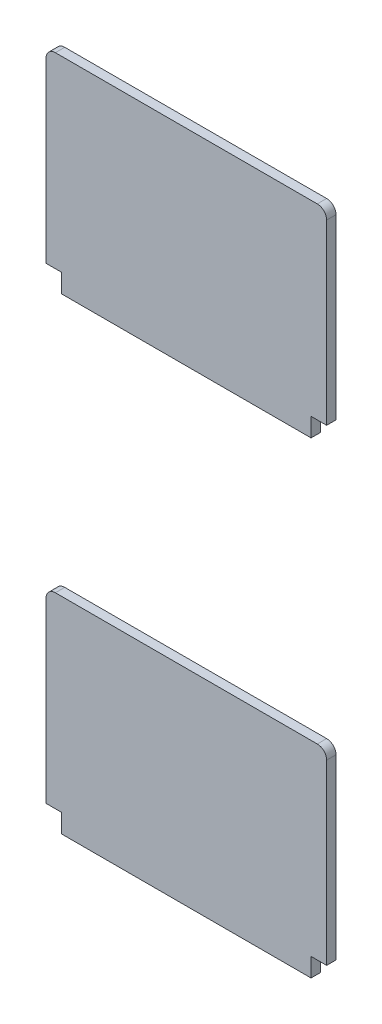
ISO-10303-21;
HEADER;
FILE_DESCRIPTION(('STEP AP214'),'2;1');
FILE_NAME('part.step','',(''),(''),'','','');
FILE_SCHEMA(('AUTOMOTIVE_DESIGN { 1 0 10303 214 1 1 1 1 }'));
ENDSEC;
DATA;
#1=APPLICATION_CONTEXT('core data for automotive mechanical design processes');
#2=APPLICATION_PROTOCOL_DEFINITION('international standard','automotive_design',2000,#1);
#3=PRODUCT_CONTEXT('',#1,'mechanical');
#4=PRODUCT('Part','Part','',(#3));
#5=PRODUCT_RELATED_PRODUCT_CATEGORY('part','',(#4));
#6=PRODUCT_DEFINITION_FORMATION('','',#4);
#7=PRODUCT_DEFINITION_CONTEXT('part definition',#1,'design');
#8=PRODUCT_DEFINITION('design','',#6,#7);
#9=PRODUCT_DEFINITION_SHAPE('','',#8);
#10=(LENGTH_UNIT() NAMED_UNIT(*) SI_UNIT(.MILLI.,.METRE.));
#11=(NAMED_UNIT(*) PLANE_ANGLE_UNIT() SI_UNIT($,.RADIAN.));
#12=(NAMED_UNIT(*) SI_UNIT($,.STERADIAN.) SOLID_ANGLE_UNIT());
#13=UNCERTAINTY_MEASURE_WITH_UNIT(LENGTH_MEASURE(1.E-05),#10,'distance_accuracy_value','');
#14=(GEOMETRIC_REPRESENTATION_CONTEXT(3) GLOBAL_UNCERTAINTY_ASSIGNED_CONTEXT((#13)) GLOBAL_UNIT_ASSIGNED_CONTEXT((#10,
#11,#12)) REPRESENTATION_CONTEXT('',''));
#15=CARTESIAN_POINT('',(0.,0.,0.));
#16=DIRECTION('',(0.,0.,1.));
#17=DIRECTION('',(1.,0.,0.));
#18=AXIS2_PLACEMENT_3D('',#15,#16,#17);
#19=CARTESIAN_POINT('',(-1.99999999999998,207.,3.));
#20=DIRECTION('',(0.,0.,-1.));
#21=DIRECTION('',(-1.,0.,0.));
#22=AXIS2_PLACEMENT_3D('',#19,#20,#21);
#23=CYLINDRICAL_SURFACE('',#22,3.00000000000001);
#24=CARTESIAN_POINT('',(-1.99999999999998,207.,0.));
#25=DIRECTION('',(0.,0.,-1.));
#26=DIRECTION('',(-1.,0.,0.));
#27=AXIS2_PLACEMENT_3D('',#24,#25,#26);
#28=CIRCLE('',#27,3.00000000000001);
#29=CARTESIAN_POINT('',(-4.99999999999999,207.,0.));
#30=VERTEX_POINT('',#29);
#31=CARTESIAN_POINT('',(-1.99999999999998,210.,0.));
#32=VERTEX_POINT('',#31);
#33=EDGE_CURVE('E162',#30,#32,#28,.T.);
#34=ORIENTED_EDGE('',*,*,#33,.F.);
#35=DIRECTION('',(0.,0.,-1.));
#36=VECTOR('',#35,1.);
#37=CARTESIAN_POINT('',(-4.99999999999999,207.,3.));
#38=LINE('',#37,#36);
#39=CARTESIAN_POINT('',(-4.99999999999999,207.,3.));
#40=VERTEX_POINT('',#39);
#41=EDGE_CURVE('E155',#40,#30,#38,.T.);
#42=ORIENTED_EDGE('',*,*,#41,.F.);
#43=CARTESIAN_POINT('',(-1.99999999999998,207.,3.));
#44=DIRECTION('',(0.,0.,-1.));
#45=DIRECTION('',(-1.,0.,0.));
#46=AXIS2_PLACEMENT_3D('',#43,#44,#45);
#47=CIRCLE('',#46,3.00000000000001);
#48=CARTESIAN_POINT('',(-1.99999999999998,210.,3.));
#49=VERTEX_POINT('',#48);
#50=EDGE_CURVE('E178',#40,#49,#47,.T.);
#51=ORIENTED_EDGE('',*,*,#50,.T.);
#52=DIRECTION('',(0.,0.,-1.));
#53=VECTOR('',#52,1.);
#54=CARTESIAN_POINT('',(-1.99999999999998,210.,3.));
#55=LINE('',#54,#53);
#56=EDGE_CURVE('E153',#49,#32,#55,.T.);
#57=ORIENTED_EDGE('',*,*,#56,.T.);
#58=EDGE_LOOP('',(#34,#42,#51,#57));
#59=FACE_BOUND('',#58,.T.);
#60=ADVANCED_FACE('F44',(#59),#23,.T.);
#61=CARTESIAN_POINT('',(-1.99999999999998,210.,3.));
#62=DIRECTION('',(0.,1.,0.));
#63=DIRECTION('',(0.,0.,1.));
#64=AXIS2_PLACEMENT_3D('',#61,#62,#63);
#65=PLANE('',#64);
#66=DIRECTION('',(1.,0.,0.));
#67=VECTOR('',#66,1.);
#68=CARTESIAN_POINT('',(-1.99999999999998,210.,0.));
#69=LINE('',#68,#67);
#70=CARTESIAN_POINT('',(82.,210.,0.));
#71=VERTEX_POINT('',#70);
#72=EDGE_CURVE('E165',#32,#71,#69,.T.);
#73=ORIENTED_EDGE('',*,*,#72,.F.);
#74=ORIENTED_EDGE('',*,*,#56,.F.);
#75=DIRECTION('',(1.,0.,0.));
#76=VECTOR('',#75,1.);
#77=CARTESIAN_POINT('',(-1.99999999999998,210.,3.));
#78=LINE('',#77,#76);
#79=CARTESIAN_POINT('',(82.,210.,3.));
#80=VERTEX_POINT('',#79);
#81=EDGE_CURVE('E181',#49,#80,#78,.T.);
#82=ORIENTED_EDGE('',*,*,#81,.T.);
#83=DIRECTION('',(0.,0.,-1.));
#84=VECTOR('',#83,1.);
#85=CARTESIAN_POINT('',(82.,210.,3.));
#86=LINE('',#85,#84);
#87=EDGE_CURVE('E145',#80,#71,#86,.T.);
#88=ORIENTED_EDGE('',*,*,#87,.T.);
#89=EDGE_LOOP('',(#73,#74,#82,#88));
#90=FACE_BOUND('',#89,.T.);
#91=ADVANCED_FACE('F191',(#90),#65,.T.);
#92=CARTESIAN_POINT('',(82.,207.,3.));
#93=DIRECTION('',(0.,0.,-1.));
#94=DIRECTION('',(-1.,0.,0.));
#95=AXIS2_PLACEMENT_3D('',#92,#93,#94);
#96=CYLINDRICAL_SURFACE('',#95,3.);
#97=CARTESIAN_POINT('',(82.,207.,0.));
#98=DIRECTION('',(0.,0.,-1.));
#99=DIRECTION('',(-1.,0.,0.));
#100=AXIS2_PLACEMENT_3D('',#97,#98,#99);
#101=CIRCLE('',#100,3.);
#102=CARTESIAN_POINT('',(85.,207.,0.));
#103=VERTEX_POINT('',#102);
#104=EDGE_CURVE('E168',#71,#103,#101,.T.);
#105=ORIENTED_EDGE('',*,*,#104,.F.);
#106=ORIENTED_EDGE('',*,*,#87,.F.);
#107=CARTESIAN_POINT('',(82.,207.,3.));
#108=DIRECTION('',(0.,0.,-1.));
#109=DIRECTION('',(-1.,0.,0.));
#110=AXIS2_PLACEMENT_3D('',#107,#108,#109);
#111=CIRCLE('',#110,3.);
#112=CARTESIAN_POINT('',(85.,207.,3.));
#113=VERTEX_POINT('',#112);
#114=EDGE_CURVE('E138',#80,#113,#111,.T.);
#115=ORIENTED_EDGE('',*,*,#114,.T.);
#116=DIRECTION('',(0.,0.,-1.));
#117=VECTOR('',#116,1.);
#118=CARTESIAN_POINT('',(85.,207.,3.));
#119=LINE('',#118,#117);
#120=EDGE_CURVE('E136',#113,#103,#119,.T.);
#121=ORIENTED_EDGE('',*,*,#120,.T.);
#122=EDGE_LOOP('',(#105,#106,#115,#121));
#123=FACE_BOUND('',#122,.T.);
#124=ADVANCED_FACE('F186',(#123),#96,.T.);
#125=CARTESIAN_POINT('',(-4.99999999999999,150.,3.));
#126=DIRECTION('',(-1.,0.,0.));
#127=DIRECTION('',(0.,0.,1.));
#128=AXIS2_PLACEMENT_3D('',#125,#126,#127);
#129=PLANE('',#128);
#130=DIRECTION('',(0.,1.,0.));
#131=VECTOR('',#130,1.);
#132=CARTESIAN_POINT('',(-4.99999999999999,150.,0.));
#133=LINE('',#132,#131);
#134=CARTESIAN_POINT('',(-4.99999999999999,150.,0.));
#135=VERTEX_POINT('',#134);
#136=EDGE_CURVE('E130',#135,#30,#133,.T.);
#137=ORIENTED_EDGE('',*,*,#136,.F.);
#138=DIRECTION('',(0.,0.,-1.));
#139=VECTOR('',#138,1.);
#140=CARTESIAN_POINT('',(-4.99999999999999,150.,3.));
#141=LINE('',#140,#139);
#142=CARTESIAN_POINT('',(-4.99999999999999,150.,3.));
#143=VERTEX_POINT('',#142);
#144=EDGE_CURVE('E157',#143,#135,#141,.T.);
#145=ORIENTED_EDGE('',*,*,#144,.F.);
#146=DIRECTION('',(0.,1.,0.));
#147=VECTOR('',#146,1.);
#148=CARTESIAN_POINT('',(-4.99999999999999,150.,3.));
#149=LINE('',#148,#147);
#150=EDGE_CURVE('E159',#143,#40,#149,.T.);
#151=ORIENTED_EDGE('',*,*,#150,.T.);
#152=ORIENTED_EDGE('',*,*,#41,.T.);
#153=EDGE_LOOP('',(#137,#145,#151,#152));
#154=FACE_BOUND('',#153,.T.);
#155=ADVANCED_FACE('F197',(#154),#129,.T.);
#156=CARTESIAN_POINT('',(85.,150.,3.));
#157=DIRECTION('',(-1.,0.,0.));
#158=DIRECTION('',(0.,0.,1.));
#159=AXIS2_PLACEMENT_3D('',#156,#157,#158);
#160=PLANE('',#159);
#161=DIRECTION('',(0.,1.,0.));
#162=VECTOR('',#161,1.);
#163=CARTESIAN_POINT('',(85.,150.,0.));
#164=LINE('',#163,#162);
#165=CARTESIAN_POINT('',(85.,150.,0.));
#166=VERTEX_POINT('',#165);
#167=EDGE_CURVE('E171',#166,#103,#164,.T.);
#168=ORIENTED_EDGE('',*,*,#167,.T.);
#169=ORIENTED_EDGE('',*,*,#120,.F.);
#170=DIRECTION('',(0.,1.,0.));
#171=VECTOR('',#170,1.);
#172=CARTESIAN_POINT('',(85.,150.,3.));
#173=LINE('',#172,#171);
#174=CARTESIAN_POINT('',(85.,150.,3.));
#175=VERTEX_POINT('',#174);
#176=EDGE_CURVE('E121',#175,#113,#173,.T.);
#177=ORIENTED_EDGE('',*,*,#176,.F.);
#178=DIRECTION('',(0.,0.,-1.));
#179=VECTOR('',#178,1.);
#180=CARTESIAN_POINT('',(85.,150.,3.));
#181=LINE('',#180,#179);
#182=EDGE_CURVE('E135',#175,#166,#181,.T.);
#183=ORIENTED_EDGE('',*,*,#182,.T.);
#184=EDGE_LOOP('',(#168,#169,#177,#183));
#185=FACE_BOUND('',#184,.T.);
#186=ADVANCED_FACE('F134',(#185),#160,.F.);
#187=CARTESIAN_POINT('',(82.,207.,0.));
#188=DIRECTION('',(0.,0.,-1.));
#189=DIRECTION('',(-1.,0.,0.));
#190=AXIS2_PLACEMENT_3D('',#187,#188,#189);
#191=PLANE('',#190);
#192=DIRECTION('',(1.,0.,0.));
#193=VECTOR('',#192,1.);
#194=CARTESIAN_POINT('',(-4.99999999999999,150.,0.));
#195=LINE('',#194,#193);
#196=CARTESIAN_POINT('',(0.,150.,0.));
#197=VERTEX_POINT('',#196);
#198=EDGE_CURVE('E173',#135,#197,#195,.T.);
#199=ORIENTED_EDGE('',*,*,#198,.F.);
#200=ORIENTED_EDGE('',*,*,#136,.T.);
#201=ORIENTED_EDGE('',*,*,#33,.T.);
#202=ORIENTED_EDGE('',*,*,#72,.T.);
#203=ORIENTED_EDGE('',*,*,#104,.T.);
#204=ORIENTED_EDGE('',*,*,#167,.F.);
#205=CARTESIAN_POINT('',(80.,150.,0.));
#206=VERTEX_POINT('',#205);
#207=EDGE_CURVE('E141',#206,#166,#195,.T.);
#208=ORIENTED_EDGE('',*,*,#207,.F.);
#209=DIRECTION('',(0.,-1.,0.));
#210=VECTOR('',#209,1.);
#211=CARTESIAN_POINT('',(80.,150.,0.));
#212=LINE('',#211,#210);
#213=CARTESIAN_POINT('',(80.,144.,0.));
#214=VERTEX_POINT('',#213);
#215=EDGE_CURVE('E12',#206,#214,#212,.T.);
#216=ORIENTED_EDGE('',*,*,#215,.T.);
#217=DIRECTION('',(1.,0.,0.));
#218=VECTOR('',#217,1.);
#219=CARTESIAN_POINT('',(0.,144.,0.));
#220=LINE('',#219,#218);
#221=CARTESIAN_POINT('',(0.,144.,0.));
#222=VERTEX_POINT('',#221);
#223=EDGE_CURVE('E54',#222,#214,#220,.T.);
#224=ORIENTED_EDGE('',*,*,#223,.F.);
#225=DIRECTION('',(0.,-1.,0.));
#226=VECTOR('',#225,1.);
#227=CARTESIAN_POINT('',(0.,150.,0.));
#228=LINE('',#227,#226);
#229=EDGE_CURVE('E213',#197,#222,#228,.T.);
#230=ORIENTED_EDGE('',*,*,#229,.F.);
#231=EDGE_LOOP('',(#199,#200,#201,#202,#203,#204,#208,#216,#224,#230));
#232=FACE_BOUND('',#231,.T.);
#233=ADVANCED_FACE('F223',(#232),#191,.T.);
#234=CARTESIAN_POINT('',(82.,207.,3.));
#235=DIRECTION('',(0.,0.,-1.));
#236=DIRECTION('',(-1.,0.,0.));
#237=AXIS2_PLACEMENT_3D('',#234,#235,#236);
#238=PLANE('',#237);
#239=DIRECTION('',(1.,0.,0.));
#240=VECTOR('',#239,1.);
#241=CARTESIAN_POINT('',(-4.99999999999999,150.,3.));
#242=LINE('',#241,#240);
#243=CARTESIAN_POINT('',(0.,150.,3.));
#244=VERTEX_POINT('',#243);
#245=EDGE_CURVE('E48',#143,#244,#242,.T.);
#246=ORIENTED_EDGE('',*,*,#245,.T.);
#247=DIRECTION('',(0.,-1.,0.));
#248=VECTOR('',#247,1.);
#249=CARTESIAN_POINT('',(0.,150.,3.));
#250=LINE('',#249,#248);
#251=CARTESIAN_POINT('',(0.,144.,3.));
#252=VERTEX_POINT('',#251);
#253=EDGE_CURVE('E203',#244,#252,#250,.T.);
#254=ORIENTED_EDGE('',*,*,#253,.T.);
#255=DIRECTION('',(1.,0.,0.));
#256=VECTOR('',#255,1.);
#257=CARTESIAN_POINT('',(0.,144.,3.));
#258=LINE('',#257,#256);
#259=CARTESIAN_POINT('',(80.,144.,3.));
#260=VERTEX_POINT('',#259);
#261=EDGE_CURVE('E206',#252,#260,#258,.T.);
#262=ORIENTED_EDGE('',*,*,#261,.T.);
#263=DIRECTION('',(0.,-1.,0.));
#264=VECTOR('',#263,1.);
#265=CARTESIAN_POINT('',(80.,150.,3.));
#266=LINE('',#265,#264);
#267=CARTESIAN_POINT('',(80.,150.,3.));
#268=VERTEX_POINT('',#267);
#269=EDGE_CURVE('E127',#268,#260,#266,.T.);
#270=ORIENTED_EDGE('',*,*,#269,.F.);
#271=EDGE_CURVE('E125',#268,#175,#242,.T.);
#272=ORIENTED_EDGE('',*,*,#271,.T.);
#273=ORIENTED_EDGE('',*,*,#176,.T.);
#274=ORIENTED_EDGE('',*,*,#114,.F.);
#275=ORIENTED_EDGE('',*,*,#81,.F.);
#276=ORIENTED_EDGE('',*,*,#50,.F.);
#277=ORIENTED_EDGE('',*,*,#150,.F.);
#278=EDGE_LOOP('',(#246,#254,#262,#270,#272,#273,#274,#275,#276,#277));
#279=FACE_BOUND('',#278,.T.);
#280=ADVANCED_FACE('F46',(#279),#238,.F.);
#281=CARTESIAN_POINT('',(-4.99999999999999,150.,3.));
#282=DIRECTION('',(0.,1.,0.));
#283=DIRECTION('',(0.,0.,1.));
#284=AXIS2_PLACEMENT_3D('',#281,#282,#283);
#285=PLANE('',#284);
#286=ORIENTED_EDGE('',*,*,#271,.F.);
#287=DIRECTION('',(0.,0.,-1.));
#288=VECTOR('',#287,1.);
#289=CARTESIAN_POINT('',(80.,150.,3.));
#290=LINE('',#289,#288);
#291=EDGE_CURVE('E143',#268,#206,#290,.T.);
#292=ORIENTED_EDGE('',*,*,#291,.T.);
#293=ORIENTED_EDGE('',*,*,#207,.T.);
#294=ORIENTED_EDGE('',*,*,#182,.F.);
#295=EDGE_LOOP('',(#286,#292,#293,#294));
#296=FACE_BOUND('',#295,.T.);
#297=ADVANCED_FACE('F139',(#296),#285,.F.);
#298=DIRECTION('',(0.,0.,-1.));
#299=VECTOR('',#298,1.);
#300=CARTESIAN_POINT('',(0.,150.,3.));
#301=LINE('',#300,#299);
#302=EDGE_CURVE('E147',#244,#197,#301,.T.);
#303=ORIENTED_EDGE('',*,*,#302,.F.);
#304=ORIENTED_EDGE('',*,*,#245,.F.);
#305=ORIENTED_EDGE('',*,*,#144,.T.);
#306=ORIENTED_EDGE('',*,*,#198,.T.);
#307=EDGE_LOOP('',(#303,#304,#305,#306));
#308=FACE_BOUND('',#307,.T.);
#309=ADVANCED_FACE('F201',(#308),#285,.F.);
#310=CARTESIAN_POINT('',(0.,144.,3.));
#311=DIRECTION('',(0.,1.,0.));
#312=DIRECTION('',(0.,0.,1.));
#313=AXIS2_PLACEMENT_3D('',#310,#311,#312);
#314=PLANE('',#313);
#315=ORIENTED_EDGE('',*,*,#223,.T.);
#316=DIRECTION('',(0.,0.,-1.));
#317=VECTOR('',#316,1.);
#318=CARTESIAN_POINT('',(80.,144.,3.));
#319=LINE('',#318,#317);
#320=EDGE_CURVE('E63',#260,#214,#319,.T.);
#321=ORIENTED_EDGE('',*,*,#320,.F.);
#322=ORIENTED_EDGE('',*,*,#261,.F.);
#323=DIRECTION('',(0.,0.,-1.));
#324=VECTOR('',#323,1.);
#325=CARTESIAN_POINT('',(0.,144.,3.));
#326=LINE('',#325,#324);
#327=EDGE_CURVE('E210',#252,#222,#326,.T.);
#328=ORIENTED_EDGE('',*,*,#327,.T.);
#329=EDGE_LOOP('',(#315,#321,#322,#328));
#330=FACE_BOUND('',#329,.T.);
#331=ADVANCED_FACE('F217',(#330),#314,.F.);
#332=CARTESIAN_POINT('',(80.,150.,3.));
#333=DIRECTION('',(1.,0.,0.));
#334=DIRECTION('',(0.,0.,-1.));
#335=AXIS2_PLACEMENT_3D('',#332,#333,#334);
#336=PLANE('',#335);
#337=ORIENTED_EDGE('',*,*,#215,.F.);
#338=ORIENTED_EDGE('',*,*,#291,.F.);
#339=ORIENTED_EDGE('',*,*,#269,.T.);
#340=ORIENTED_EDGE('',*,*,#320,.T.);
#341=EDGE_LOOP('',(#337,#338,#339,#340));
#342=FACE_BOUND('',#341,.T.);
#343=ADVANCED_FACE('F224',(#342),#336,.T.);
#344=CARTESIAN_POINT('',(0.,150.,3.));
#345=DIRECTION('',(1.,0.,0.));
#346=DIRECTION('',(0.,0.,-1.));
#347=AXIS2_PLACEMENT_3D('',#344,#345,#346);
#348=PLANE('',#347);
#349=ORIENTED_EDGE('',*,*,#229,.T.);
#350=ORIENTED_EDGE('',*,*,#327,.F.);
#351=ORIENTED_EDGE('',*,*,#253,.F.);
#352=ORIENTED_EDGE('',*,*,#302,.T.);
#353=EDGE_LOOP('',(#349,#350,#351,#352));
#354=FACE_BOUND('',#353,.T.);
#355=ADVANCED_FACE('F211',(#354),#348,.F.);
#356=CLOSED_SHELL('',(#60,#91,#124,#155,#186,#233,#280,#297,#309,#331,#343,#355));
#357=MANIFOLD_SOLID_BREP('B2',#356);
#358=CARTESIAN_POINT('',(80.,0.,3.));
#359=DIRECTION('',(1.,0.,0.));
#360=DIRECTION('',(0.,0.,-1.));
#361=AXIS2_PLACEMENT_3D('',#358,#359,#360);
#362=PLANE('',#361);
#363=DIRECTION('',(0.,-1.,0.));
#364=VECTOR('',#363,1.);
#365=CARTESIAN_POINT('',(80.,0.,0.));
#366=LINE('',#365,#364);
#367=CARTESIAN_POINT('',(80.,0.,0.));
#368=VERTEX_POINT('',#367);
#369=CARTESIAN_POINT('',(80.,-6.,0.));
#370=VERTEX_POINT('',#369);
#371=EDGE_CURVE('E427',#368,#370,#366,.T.);
#372=ORIENTED_EDGE('',*,*,#371,.F.);
#373=DIRECTION('',(0.,0.,-1.));
#374=VECTOR('',#373,1.);
#375=CARTESIAN_POINT('',(80.,0.,3.));
#376=LINE('',#375,#374);
#377=CARTESIAN_POINT('',(80.,0.,3.));
#378=VERTEX_POINT('',#377);
#379=EDGE_CURVE('E42',#378,#368,#376,.T.);
#380=ORIENTED_EDGE('',*,*,#379,.F.);
#381=DIRECTION('',(0.,-1.,0.));
#382=VECTOR('',#381,1.);
#383=CARTESIAN_POINT('',(80.,0.,3.));
#384=LINE('',#383,#382);
#385=CARTESIAN_POINT('',(80.,-6.,3.));
#386=VERTEX_POINT('',#385);
#387=EDGE_CURVE('E450',#378,#386,#384,.T.);
#388=ORIENTED_EDGE('',*,*,#387,.T.);
#389=DIRECTION('',(0.,0.,-1.));
#390=VECTOR('',#389,1.);
#391=CARTESIAN_POINT('',(80.,-6.,3.));
#392=LINE('',#391,#390);
#393=EDGE_CURVE('E377',#386,#370,#392,.T.);
#394=ORIENTED_EDGE('',*,*,#393,.T.);
#395=EDGE_LOOP('',(#372,#380,#388,#394));
#396=FACE_BOUND('',#395,.T.);
#397=ADVANCED_FACE('F320',(#396),#362,.T.);
#398=CARTESIAN_POINT('',(0.,0.,3.));
#399=DIRECTION('',(0.,1.,0.));
#400=DIRECTION('',(0.,0.,1.));
#401=AXIS2_PLACEMENT_3D('',#398,#399,#400);
#402=PLANE('',#401);
#403=DIRECTION('',(1.,0.,0.));
#404=VECTOR('',#403,1.);
#405=CARTESIAN_POINT('',(0.,0.,0.));
#406=LINE('',#405,#404);
#407=CARTESIAN_POINT('',(85.,0.,0.));
#408=VERTEX_POINT('',#407);
#409=EDGE_CURVE('E430',#368,#408,#406,.T.);
#410=ORIENTED_EDGE('',*,*,#409,.T.);
#411=DIRECTION('',(0.,0.,-1.));
#412=VECTOR('',#411,1.);
#413=CARTESIAN_POINT('',(85.,0.,3.));
#414=LINE('',#413,#412);
#415=CARTESIAN_POINT('',(85.,0.,3.));
#416=VERTEX_POINT('',#415);
#417=EDGE_CURVE('E328',#416,#408,#414,.T.);
#418=ORIENTED_EDGE('',*,*,#417,.F.);
#419=DIRECTION('',(1.,0.,0.));
#420=VECTOR('',#419,1.);
#421=CARTESIAN_POINT('',(0.,0.,3.));
#422=LINE('',#421,#420);
#423=EDGE_CURVE('E413',#378,#416,#422,.T.);
#424=ORIENTED_EDGE('',*,*,#423,.F.);
#425=ORIENTED_EDGE('',*,*,#379,.T.);
#426=EDGE_LOOP('',(#410,#418,#424,#425));
#427=FACE_BOUND('',#426,.T.);
#428=ADVANCED_FACE('F497',(#427),#402,.F.);
#429=CARTESIAN_POINT('',(85.,0.,3.));
#430=DIRECTION('',(-1.,0.,0.));
#431=DIRECTION('',(0.,0.,1.));
#432=AXIS2_PLACEMENT_3D('',#429,#430,#431);
#433=PLANE('',#432);
#434=DIRECTION('',(0.,1.,0.));
#435=VECTOR('',#434,1.);
#436=CARTESIAN_POINT('',(85.,0.,0.));
#437=LINE('',#436,#435);
#438=CARTESIAN_POINT('',(85.,57.,0.));
#439=VERTEX_POINT('',#438);
#440=EDGE_CURVE('E432',#408,#439,#437,.T.);
#441=ORIENTED_EDGE('',*,*,#440,.T.);
#442=DIRECTION('',(0.,0.,-1.));
#443=VECTOR('',#442,1.);
#444=CARTESIAN_POINT('',(85.,57.,3.));
#445=LINE('',#444,#443);
#446=CARTESIAN_POINT('',(85.,57.,3.));
#447=VERTEX_POINT('',#446);
#448=EDGE_CURVE('E460',#447,#439,#445,.T.);
#449=ORIENTED_EDGE('',*,*,#448,.F.);
#450=DIRECTION('',(0.,1.,0.));
#451=VECTOR('',#450,1.);
#452=CARTESIAN_POINT('',(85.,0.,3.));
#453=LINE('',#452,#451);
#454=EDGE_CURVE('E468',#416,#447,#453,.T.);
#455=ORIENTED_EDGE('',*,*,#454,.F.);
#456=ORIENTED_EDGE('',*,*,#417,.T.);
#457=EDGE_LOOP('',(#441,#449,#455,#456));
#458=FACE_BOUND('',#457,.T.);
#459=ADVANCED_FACE('F466',(#458),#433,.F.);
#460=CARTESIAN_POINT('',(82.,57.,3.));
#461=DIRECTION('',(0.,0.,-1.));
#462=DIRECTION('',(-1.,0.,0.));
#463=AXIS2_PLACEMENT_3D('',#460,#461,#462);
#464=CYLINDRICAL_SURFACE('',#463,3.);
#465=CARTESIAN_POINT('',(82.,57.,0.));
#466=DIRECTION('',(0.,0.,1.));
#467=DIRECTION('',(1.,0.,0.));
#468=AXIS2_PLACEMENT_3D('',#465,#466,#467);
#469=CIRCLE('',#468,3.);
#470=CARTESIAN_POINT('',(82.,60.,0.));
#471=VERTEX_POINT('',#470);
#472=EDGE_CURVE('E435',#471,#439,#469,.F.);
#473=ORIENTED_EDGE('',*,*,#472,.F.);
#474=DIRECTION('',(0.,0.,-1.));
#475=VECTOR('',#474,1.);
#476=CARTESIAN_POINT('',(82.,60.,3.));
#477=LINE('',#476,#475);
#478=CARTESIAN_POINT('',(82.,60.,3.));
#479=VERTEX_POINT('',#478);
#480=EDGE_CURVE('E458',#479,#471,#477,.T.);
#481=ORIENTED_EDGE('',*,*,#480,.F.);
#482=CARTESIAN_POINT('',(82.,57.,3.));
#483=DIRECTION('',(0.,0.,1.));
#484=DIRECTION('',(1.,0.,0.));
#485=AXIS2_PLACEMENT_3D('',#482,#483,#484);
#486=CIRCLE('',#485,3.);
#487=EDGE_CURVE('E479',#479,#447,#486,.F.);
#488=ORIENTED_EDGE('',*,*,#487,.T.);
#489=ORIENTED_EDGE('',*,*,#448,.T.);
#490=EDGE_LOOP('',(#473,#481,#488,#489));
#491=FACE_BOUND('',#490,.T.);
#492=ADVANCED_FACE('F476',(#491),#464,.T.);
#493=CARTESIAN_POINT('',(0.,60.,3.));
#494=DIRECTION('',(0.,1.,0.));
#495=DIRECTION('',(0.,0.,1.));
#496=AXIS2_PLACEMENT_3D('',#493,#494,#495);
#497=PLANE('',#496);
#498=DIRECTION('',(1.,0.,0.));
#499=VECTOR('',#498,1.);
#500=CARTESIAN_POINT('',(0.,60.,0.));
#501=LINE('',#500,#499);
#502=CARTESIAN_POINT('',(-1.99999999999999,60.,0.));
#503=VERTEX_POINT('',#502);
#504=EDGE_CURVE('E438',#503,#471,#501,.T.);
#505=ORIENTED_EDGE('',*,*,#504,.F.);
#506=DIRECTION('',(0.,0.,-1.));
#507=VECTOR('',#506,1.);
#508=CARTESIAN_POINT('',(-1.99999999999999,60.,3.));
#509=LINE('',#508,#507);
#510=CARTESIAN_POINT('',(-1.99999999999999,60.,3.));
#511=VERTEX_POINT('',#510);
#512=EDGE_CURVE('E456',#511,#503,#509,.T.);
#513=ORIENTED_EDGE('',*,*,#512,.F.);
#514=DIRECTION('',(1.,0.,0.));
#515=VECTOR('',#514,1.);
#516=CARTESIAN_POINT('',(0.,60.,3.));
#517=LINE('',#516,#515);
#518=EDGE_CURVE('E482',#511,#479,#517,.T.);
#519=ORIENTED_EDGE('',*,*,#518,.T.);
#520=ORIENTED_EDGE('',*,*,#480,.T.);
#521=EDGE_LOOP('',(#505,#513,#519,#520));
#522=FACE_BOUND('',#521,.T.);
#523=ADVANCED_FACE('F515',(#522),#497,.T.);
#524=CARTESIAN_POINT('',(-1.99999999999999,57.,3.));
#525=DIRECTION('',(0.,0.,-1.));
#526=DIRECTION('',(-1.,0.,0.));
#527=AXIS2_PLACEMENT_3D('',#524,#525,#526);
#528=CYLINDRICAL_SURFACE('',#527,3.00000000000001);
#529=CARTESIAN_POINT('',(-1.99999999999999,57.,0.));
#530=DIRECTION('',(0.,0.,1.));
#531=DIRECTION('',(1.,0.,0.));
#532=AXIS2_PLACEMENT_3D('',#529,#530,#531);
#533=CIRCLE('',#532,3.00000000000001);
#534=CARTESIAN_POINT('',(-5.,57.,0.));
#535=VERTEX_POINT('',#534);
#536=EDGE_CURVE('E441',#535,#503,#533,.F.);
#537=ORIENTED_EDGE('',*,*,#536,.F.);
#538=DIRECTION('',(0.,0.,-1.));
#539=VECTOR('',#538,1.);
#540=CARTESIAN_POINT('',(-5.,57.,3.));
#541=LINE('',#540,#539);
#542=CARTESIAN_POINT('',(-5.,57.,3.));
#543=VERTEX_POINT('',#542);
#544=EDGE_CURVE('E454',#543,#535,#541,.T.);
#545=ORIENTED_EDGE('',*,*,#544,.F.);
#546=CARTESIAN_POINT('',(-1.99999999999999,57.,3.));
#547=DIRECTION('',(0.,0.,1.));
#548=DIRECTION('',(1.,0.,0.));
#549=AXIS2_PLACEMENT_3D('',#546,#547,#548);
#550=CIRCLE('',#549,3.00000000000001);
#551=EDGE_CURVE('E484',#543,#511,#550,.F.);
#552=ORIENTED_EDGE('',*,*,#551,.T.);
#553=ORIENTED_EDGE('',*,*,#512,.T.);
#554=EDGE_LOOP('',(#537,#545,#552,#553));
#555=FACE_BOUND('',#554,.T.);
#556=ADVANCED_FACE('F511',(#555),#528,.T.);
#557=CARTESIAN_POINT('',(-5.,0.,3.));
#558=DIRECTION('',(-1.,0.,0.));
#559=DIRECTION('',(0.,0.,1.));
#560=AXIS2_PLACEMENT_3D('',#557,#558,#559);
#561=PLANE('',#560);
#562=DIRECTION('',(0.,1.,0.));
#563=VECTOR('',#562,1.);
#564=CARTESIAN_POINT('',(-5.,0.,0.));
#565=LINE('',#564,#563);
#566=CARTESIAN_POINT('',(-5.,0.,0.));
#567=VERTEX_POINT('',#566);
#568=EDGE_CURVE('E444',#567,#535,#565,.T.);
#569=ORIENTED_EDGE('',*,*,#568,.F.);
#570=DIRECTION('',(0.,0.,-1.));
#571=VECTOR('',#570,1.);
#572=CARTESIAN_POINT('',(-5.,0.,3.));
#573=LINE('',#572,#571);
#574=CARTESIAN_POINT('',(-5.,0.,3.));
#575=VERTEX_POINT('',#574);
#576=EDGE_CURVE('E418',#575,#567,#573,.T.);
#577=ORIENTED_EDGE('',*,*,#576,.F.);
#578=DIRECTION('',(0.,1.,0.));
#579=VECTOR('',#578,1.);
#580=CARTESIAN_POINT('',(-5.,0.,3.));
#581=LINE('',#580,#579);
#582=EDGE_CURVE('E410',#575,#543,#581,.T.);
#583=ORIENTED_EDGE('',*,*,#582,.T.);
#584=ORIENTED_EDGE('',*,*,#544,.T.);
#585=EDGE_LOOP('',(#569,#577,#583,#584));
#586=FACE_BOUND('',#585,.T.);
#587=ADVANCED_FACE('F491',(#586),#561,.T.);
#588=CARTESIAN_POINT('',(0.,0.,0.));
#589=VERTEX_POINT('',#588);
#590=EDGE_CURVE('E417',#567,#589,#406,.T.);
#591=ORIENTED_EDGE('',*,*,#590,.T.);
#592=DIRECTION('',(0.,0.,-1.));
#593=VECTOR('',#592,1.);
#594=CARTESIAN_POINT('',(0.,0.,3.));
#595=LINE('',#594,#593);
#596=CARTESIAN_POINT('',(0.,0.,3.));
#597=VERTEX_POINT('',#596);
#598=EDGE_CURVE('E414',#597,#589,#595,.T.);
#599=ORIENTED_EDGE('',*,*,#598,.F.);
#600=EDGE_CURVE('E403',#575,#597,#422,.T.);
#601=ORIENTED_EDGE('',*,*,#600,.F.);
#602=ORIENTED_EDGE('',*,*,#576,.T.);
#603=EDGE_LOOP('',(#591,#599,#601,#602));
#604=FACE_BOUND('',#603,.T.);
#605=ADVANCED_FACE('F415',(#604),#402,.F.);
#606=CARTESIAN_POINT('',(0.,0.,3.));
#607=DIRECTION('',(1.,0.,0.));
#608=DIRECTION('',(0.,0.,-1.));
#609=AXIS2_PLACEMENT_3D('',#606,#607,#608);
#610=PLANE('',#609);
#611=DIRECTION('',(0.,-1.,0.));
#612=VECTOR('',#611,1.);
#613=CARTESIAN_POINT('',(0.,0.,0.));
#614=LINE('',#613,#612);
#615=CARTESIAN_POINT('',(0.,-6.,0.));
#616=VERTEX_POINT('',#615);
#617=EDGE_CURVE('E370',#589,#616,#614,.T.);
#618=ORIENTED_EDGE('',*,*,#617,.T.);
#619=DIRECTION('',(0.,0.,-1.));
#620=VECTOR('',#619,1.);
#621=CARTESIAN_POINT('',(0.,-6.,3.));
#622=LINE('',#621,#620);
#623=CARTESIAN_POINT('',(0.,-6.,3.));
#624=VERTEX_POINT('',#623);
#625=EDGE_CURVE('E419',#624,#616,#622,.T.);
#626=ORIENTED_EDGE('',*,*,#625,.F.);
#627=DIRECTION('',(0.,-1.,0.));
#628=VECTOR('',#627,1.);
#629=CARTESIAN_POINT('',(0.,0.,3.));
#630=LINE('',#629,#628);
#631=EDGE_CURVE('E407',#597,#624,#630,.T.);
#632=ORIENTED_EDGE('',*,*,#631,.F.);
#633=ORIENTED_EDGE('',*,*,#598,.T.);
#634=EDGE_LOOP('',(#618,#626,#632,#633));
#635=FACE_BOUND('',#634,.T.);
#636=ADVANCED_FACE('F421',(#635),#610,.F.);
#637=CARTESIAN_POINT('',(0.,-6.,3.));
#638=DIRECTION('',(0.,1.,0.));
#639=DIRECTION('',(0.,0.,1.));
#640=AXIS2_PLACEMENT_3D('',#637,#638,#639);
#641=PLANE('',#640);
#642=DIRECTION('',(1.,0.,0.));
#643=VECTOR('',#642,1.);
#644=CARTESIAN_POINT('',(0.,-6.,0.));
#645=LINE('',#644,#643);
#646=EDGE_CURVE('E448',#616,#370,#645,.T.);
#647=ORIENTED_EDGE('',*,*,#646,.T.);
#648=ORIENTED_EDGE('',*,*,#393,.F.);
#649=DIRECTION('',(1.,0.,0.));
#650=VECTOR('',#649,1.);
#651=CARTESIAN_POINT('',(0.,-6.,3.));
#652=LINE('',#651,#650);
#653=EDGE_CURVE('E336',#624,#386,#652,.T.);
#654=ORIENTED_EDGE('',*,*,#653,.F.);
#655=ORIENTED_EDGE('',*,*,#625,.T.);
#656=EDGE_LOOP('',(#647,#648,#654,#655));
#657=FACE_BOUND('',#656,.T.);
#658=ADVANCED_FACE('F495',(#657),#641,.F.);
#659=CARTESIAN_POINT('',(0.,0.,3.));
#660=DIRECTION('',(0.,0.,1.));
#661=DIRECTION('',(1.,0.,0.));
#662=AXIS2_PLACEMENT_3D('',#659,#660,#661);
#663=PLANE('',#662);
#664=ORIENTED_EDGE('',*,*,#387,.F.);
#665=ORIENTED_EDGE('',*,*,#423,.T.);
#666=ORIENTED_EDGE('',*,*,#454,.T.);
#667=ORIENTED_EDGE('',*,*,#487,.F.);
#668=ORIENTED_EDGE('',*,*,#518,.F.);
#669=ORIENTED_EDGE('',*,*,#551,.F.);
#670=ORIENTED_EDGE('',*,*,#582,.F.);
#671=ORIENTED_EDGE('',*,*,#600,.T.);
#672=ORIENTED_EDGE('',*,*,#631,.T.);
#673=ORIENTED_EDGE('',*,*,#653,.T.);
#674=EDGE_LOOP('',(#664,#665,#666,#667,#668,#669,#670,#671,#672,#673));
#675=FACE_BOUND('',#674,.T.);
#676=ADVANCED_FACE('F405',(#675),#663,.T.);
#677=CARTESIAN_POINT('',(0.,0.,0.));
#678=DIRECTION('',(0.,0.,1.));
#679=DIRECTION('',(1.,0.,0.));
#680=AXIS2_PLACEMENT_3D('',#677,#678,#679);
#681=PLANE('',#680);
#682=ORIENTED_EDGE('',*,*,#371,.T.);
#683=ORIENTED_EDGE('',*,*,#646,.F.);
#684=ORIENTED_EDGE('',*,*,#617,.F.);
#685=ORIENTED_EDGE('',*,*,#590,.F.);
#686=ORIENTED_EDGE('',*,*,#568,.T.);
#687=ORIENTED_EDGE('',*,*,#536,.T.);
#688=ORIENTED_EDGE('',*,*,#504,.T.);
#689=ORIENTED_EDGE('',*,*,#472,.T.);
#690=ORIENTED_EDGE('',*,*,#440,.F.);
#691=ORIENTED_EDGE('',*,*,#409,.F.);
#692=EDGE_LOOP('',(#682,#683,#684,#685,#686,#687,#688,#689,#690,#691));
#693=FACE_BOUND('',#692,.T.);
#694=ADVANCED_FACE('F472',(#693),#681,.F.);
#695=CLOSED_SHELL('',(#397,#428,#459,#492,#523,#556,#587,#605,#636,#658,#676,#694));
#696=MANIFOLD_SOLID_BREP('B6',#695);
#697=ADVANCED_BREP_SHAPE_REPRESENTATION('',(#18,#357,#696),#14);
#698=SHAPE_DEFINITION_REPRESENTATION(#9,#697);
ENDSEC;
END-ISO-10303-21;
